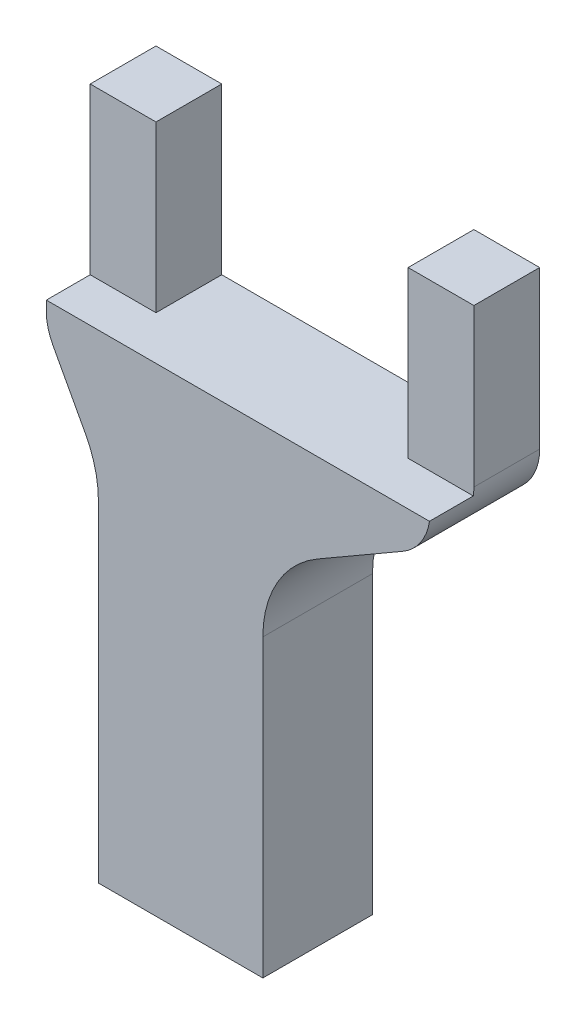
ISO-10303-21;
HEADER;
FILE_DESCRIPTION(('STEP AP214'),'2;1');
FILE_NAME('part.step','',(''),(''),'','','');
FILE_SCHEMA(('AUTOMOTIVE_DESIGN { 1 0 10303 214 1 1 1 1 }'));
ENDSEC;
DATA;
#1=APPLICATION_CONTEXT('core data for automotive mechanical design processes');
#2=APPLICATION_PROTOCOL_DEFINITION('international standard','automotive_design',2000,#1);
#3=PRODUCT_CONTEXT('',#1,'mechanical');
#4=PRODUCT('Part','Part','',(#3));
#5=PRODUCT_RELATED_PRODUCT_CATEGORY('part','',(#4));
#6=PRODUCT_DEFINITION_FORMATION('','',#4);
#7=PRODUCT_DEFINITION_CONTEXT('part definition',#1,'design');
#8=PRODUCT_DEFINITION('design','',#6,#7);
#9=PRODUCT_DEFINITION_SHAPE('','',#8);
#10=(LENGTH_UNIT() NAMED_UNIT(*) SI_UNIT(.MILLI.,.METRE.));
#11=(NAMED_UNIT(*) PLANE_ANGLE_UNIT() SI_UNIT($,.RADIAN.));
#12=(NAMED_UNIT(*) SI_UNIT($,.STERADIAN.) SOLID_ANGLE_UNIT());
#13=UNCERTAINTY_MEASURE_WITH_UNIT(LENGTH_MEASURE(1.E-05),#10,'distance_accuracy_value','');
#14=(GEOMETRIC_REPRESENTATION_CONTEXT(3) GLOBAL_UNCERTAINTY_ASSIGNED_CONTEXT((#13)) GLOBAL_UNIT_ASSIGNED_CONTEXT((#10,
#11,#12)) REPRESENTATION_CONTEXT('',''));
#15=CARTESIAN_POINT('',(0.,0.,0.));
#16=DIRECTION('',(0.,0.,1.));
#17=DIRECTION('',(1.,0.,0.));
#18=AXIS2_PLACEMENT_3D('',#15,#16,#17);
#19=CARTESIAN_POINT('',(-6.24999999999976,526.071170630325,10.));
#20=DIRECTION('',(0.,-1.,0.));
#21=DIRECTION('',(0.,0.,-1.));
#22=AXIS2_PLACEMENT_3D('',#19,#20,#21);
#23=PLANE('',#22);
#24=DIRECTION('',(-1.,0.,0.));
#25=VECTOR('',#24,1.);
#26=CARTESIAN_POINT('',(-12.2499999999998,526.071170630325,6.));
#27=LINE('',#26,#25);
#28=CARTESIAN_POINT('',(-6.24999999999976,526.071170630325,6.));
#29=VERTEX_POINT('',#28);
#30=CARTESIAN_POINT('',(-12.2499999999998,526.071170630325,6.));
#31=VERTEX_POINT('',#30);
#32=EDGE_CURVE('E177',#29,#31,#27,.T.);
#33=ORIENTED_EDGE('',*,*,#32,.F.);
#34=DIRECTION('',(0.,0.,-1.));
#35=VECTOR('',#34,1.);
#36=CARTESIAN_POINT('',(-6.24999999999976,526.071170630325,10.));
#37=LINE('',#36,#35);
#38=CARTESIAN_POINT('',(-6.24999999999976,526.071170630325,0.));
#39=VERTEX_POINT('',#38);
#40=EDGE_CURVE('E209',#29,#39,#37,.T.);
#41=ORIENTED_EDGE('',*,*,#40,.T.);
#42=DIRECTION('',(-1.,0.,0.));
#43=VECTOR('',#42,1.);
#44=CARTESIAN_POINT('',(-6.24999999999976,526.071170630325,0.));
#45=LINE('',#44,#43);
#46=CARTESIAN_POINT('',(-12.2499999999998,526.071170630325,0.));
#47=VERTEX_POINT('',#46);
#48=EDGE_CURVE('E193',#39,#47,#45,.T.);
#49=ORIENTED_EDGE('',*,*,#48,.T.);
#50=DIRECTION('',(0.,0.,-1.));
#51=VECTOR('',#50,1.);
#52=CARTESIAN_POINT('',(-12.2499999999998,526.071170630325,10.));
#53=LINE('',#52,#51);
#54=EDGE_CURVE('E254',#31,#47,#53,.T.);
#55=ORIENTED_EDGE('',*,*,#54,.F.);
#56=EDGE_LOOP('',(#33,#41,#49,#55));
#57=FACE_BOUND('',#56,.T.);
#58=ADVANCED_FACE('F38',(#57),#23,.F.);
#59=CARTESIAN_POINT('',(22.7500000000002,526.071170630325,10.));
#60=DIRECTION('',(-1.,0.,0.));
#61=DIRECTION('',(0.,-1.,0.));
#62=AXIS2_PLACEMENT_3D('',#59,#60,#61);
#63=PLANE('',#62);
#64=DIRECTION('',(0.,1.,0.));
#65=VECTOR('',#64,1.);
#66=CARTESIAN_POINT('',(22.7500000000002,526.071170630325,6.));
#67=LINE('',#66,#65);
#68=CARTESIAN_POINT('',(22.7500000000003,511.729317394923,6.));
#69=VERTEX_POINT('',#68);
#70=CARTESIAN_POINT('',(22.7500000000002,526.071170630325,6.));
#71=VERTEX_POINT('',#70);
#72=EDGE_CURVE('E171',#69,#71,#67,.T.);
#73=ORIENTED_EDGE('',*,*,#72,.F.);
#74=DIRECTION('',(0.,0.,-1.));
#75=VECTOR('',#74,1.);
#76=CARTESIAN_POINT('',(22.7500000000003,511.729317394923,10.));
#77=LINE('',#76,#75);
#78=CARTESIAN_POINT('',(22.7500000000003,511.729317394923,0.));
#79=VERTEX_POINT('',#78);
#80=EDGE_CURVE('E289',#69,#79,#77,.T.);
#81=ORIENTED_EDGE('',*,*,#80,.T.);
#82=DIRECTION('',(0.,1.,0.));
#83=VECTOR('',#82,1.);
#84=CARTESIAN_POINT('',(22.7500000000002,526.071170630325,0.));
#85=LINE('',#84,#83);
#86=CARTESIAN_POINT('',(22.7500000000002,526.071170630325,0.));
#87=VERTEX_POINT('',#86);
#88=EDGE_CURVE('E227',#79,#87,#85,.T.);
#89=ORIENTED_EDGE('',*,*,#88,.T.);
#90=DIRECTION('',(0.,0.,-1.));
#91=VECTOR('',#90,1.);
#92=CARTESIAN_POINT('',(22.7500000000002,526.071170630325,10.));
#93=LINE('',#92,#91);
#94=EDGE_CURVE('E246',#71,#87,#93,.T.);
#95=ORIENTED_EDGE('',*,*,#94,.F.);
#96=EDGE_LOOP('',(#73,#81,#89,#95));
#97=FACE_BOUND('',#96,.T.);
#98=ADVANCED_FACE('F303',(#97),#63,.F.);
#99=CARTESIAN_POINT('',(16.7500000000002,526.071170630325,10.));
#100=DIRECTION('',(0.,-1.,0.));
#101=DIRECTION('',(0.,0.,-1.));
#102=AXIS2_PLACEMENT_3D('',#99,#100,#101);
#103=PLANE('',#102);
#104=CARTESIAN_POINT('',(16.7500000000003,526.071170630325,6.));
#105=VERTEX_POINT('',#104);
#106=EDGE_CURVE('E185',#71,#105,#27,.T.);
#107=ORIENTED_EDGE('',*,*,#106,.F.);
#108=ORIENTED_EDGE('',*,*,#94,.T.);
#109=DIRECTION('',(-1.,0.,0.));
#110=VECTOR('',#109,1.);
#111=CARTESIAN_POINT('',(16.7500000000002,526.071170630325,0.));
#112=LINE('',#111,#110);
#113=CARTESIAN_POINT('',(16.7500000000002,526.071170630325,0.));
#114=VERTEX_POINT('',#113);
#115=EDGE_CURVE('E230',#87,#114,#112,.T.);
#116=ORIENTED_EDGE('',*,*,#115,.T.);
#117=DIRECTION('',(0.,0.,-1.));
#118=VECTOR('',#117,1.);
#119=CARTESIAN_POINT('',(16.7500000000002,526.071170630325,10.));
#120=LINE('',#119,#118);
#121=EDGE_CURVE('E244',#105,#114,#120,.T.);
#122=ORIENTED_EDGE('',*,*,#121,.F.);
#123=EDGE_LOOP('',(#107,#108,#116,#122));
#124=FACE_BOUND('',#123,.T.);
#125=ADVANCED_FACE('F307',(#124),#103,.F.);
#126=CARTESIAN_POINT('',(16.7500000000002,526.071170630325,10.));
#127=DIRECTION('',(1.,0.,0.));
#128=DIRECTION('',(0.,1.,0.));
#129=AXIS2_PLACEMENT_3D('',#126,#127,#128);
#130=PLANE('',#129);
#131=DIRECTION('',(0.,-1.,0.));
#132=VECTOR('',#131,1.);
#133=CARTESIAN_POINT('',(16.7500000000002,526.071170630325,6.));
#134=LINE('',#133,#132);
#135=CARTESIAN_POINT('',(16.7500000000003,511.000207075114,6.));
#136=VERTEX_POINT('',#135);
#137=EDGE_CURVE('E187',#105,#136,#134,.T.);
#138=ORIENTED_EDGE('',*,*,#137,.F.);
#139=ORIENTED_EDGE('',*,*,#121,.T.);
#140=DIRECTION('',(0.,-1.,0.));
#141=VECTOR('',#140,1.);
#142=CARTESIAN_POINT('',(16.7500000000002,526.071170630325,0.));
#143=LINE('',#142,#141);
#144=CARTESIAN_POINT('',(16.7500000000003,511.000207075114,0.));
#145=VERTEX_POINT('',#144);
#146=EDGE_CURVE('E233',#114,#145,#143,.T.);
#147=ORIENTED_EDGE('',*,*,#146,.T.);
#148=DIRECTION('',(0.,0.,-1.));
#149=VECTOR('',#148,1.);
#150=CARTESIAN_POINT('',(16.7500000000003,511.000207075114,10.));
#151=LINE('',#150,#149);
#152=EDGE_CURVE('E242',#136,#145,#151,.T.);
#153=ORIENTED_EDGE('',*,*,#152,.F.);
#154=EDGE_LOOP('',(#138,#139,#147,#153));
#155=FACE_BOUND('',#154,.T.);
#156=ADVANCED_FACE('F313',(#155),#130,.F.);
#157=CARTESIAN_POINT('',(-6.24999999999976,526.071170630325,10.));
#158=DIRECTION('',(-1.,0.,0.));
#159=DIRECTION('',(0.,-1.,0.));
#160=AXIS2_PLACEMENT_3D('',#157,#158,#159);
#161=PLANE('',#160);
#162=DIRECTION('',(0.,1.,0.));
#163=VECTOR('',#162,1.);
#164=CARTESIAN_POINT('',(-6.24999999999976,526.071170630325,6.));
#165=LINE('',#164,#163);
#166=CARTESIAN_POINT('',(-6.24999999999976,511.000207075114,6.));
#167=VERTEX_POINT('',#166);
#168=EDGE_CURVE('E184',#167,#29,#165,.T.);
#169=ORIENTED_EDGE('',*,*,#168,.F.);
#170=DIRECTION('',(0.,0.,-1.));
#171=VECTOR('',#170,1.);
#172=CARTESIAN_POINT('',(-6.24999999999976,511.000207075114,10.));
#173=LINE('',#172,#171);
#174=CARTESIAN_POINT('',(-6.24999999999976,511.000207075114,0.));
#175=VERTEX_POINT('',#174);
#176=EDGE_CURVE('E168',#167,#175,#173,.T.);
#177=ORIENTED_EDGE('',*,*,#176,.T.);
#178=DIRECTION('',(0.,1.,0.));
#179=VECTOR('',#178,1.);
#180=CARTESIAN_POINT('',(-6.24999999999976,526.071170630325,0.));
#181=LINE('',#180,#179);
#182=EDGE_CURVE('E196',#175,#39,#181,.T.);
#183=ORIENTED_EDGE('',*,*,#182,.T.);
#184=ORIENTED_EDGE('',*,*,#40,.F.);
#185=EDGE_LOOP('',(#169,#177,#183,#184));
#186=FACE_BOUND('',#185,.T.);
#187=ADVANCED_FACE('F323',(#186),#161,.F.);
#188=CARTESIAN_POINT('',(-12.2499999999998,526.071170630325,10.));
#189=DIRECTION('',(1.,0.,0.));
#190=DIRECTION('',(0.,1.,0.));
#191=AXIS2_PLACEMENT_3D('',#188,#189,#190);
#192=PLANE('',#191);
#193=DIRECTION('',(0.,-1.,0.));
#194=VECTOR('',#193,1.);
#195=CARTESIAN_POINT('',(-12.2499999999998,526.071170630325,10.));
#196=LINE('',#195,#194);
#197=CARTESIAN_POINT('',(-12.2499999999998,511.000207075114,10.));
#198=VERTEX_POINT('',#197);
#199=CARTESIAN_POINT('',(-12.2499999999998,510.105275726691,10.));
#200=VERTEX_POINT('',#199);
#201=EDGE_CURVE('E183',#198,#200,#196,.T.);
#202=ORIENTED_EDGE('',*,*,#201,.F.);
#203=DIRECTION('',(0.,0.,1.));
#204=VECTOR('',#203,1.);
#205=CARTESIAN_POINT('',(-12.2499999999998,511.000207075114,6.));
#206=LINE('',#205,#204);
#207=CARTESIAN_POINT('',(-12.2499999999998,511.000207075114,6.));
#208=VERTEX_POINT('',#207);
#209=EDGE_CURVE('E165',#208,#198,#206,.T.);
#210=ORIENTED_EDGE('',*,*,#209,.F.);
#211=DIRECTION('',(0.,-1.,0.));
#212=VECTOR('',#211,1.);
#213=CARTESIAN_POINT('',(-12.2499999999998,526.071170630325,6.));
#214=LINE('',#213,#212);
#215=EDGE_CURVE('E174',#31,#208,#214,.T.);
#216=ORIENTED_EDGE('',*,*,#215,.F.);
#217=ORIENTED_EDGE('',*,*,#54,.T.);
#218=DIRECTION('',(0.,-1.,0.));
#219=VECTOR('',#218,1.);
#220=CARTESIAN_POINT('',(-12.2499999999998,526.071170630325,0.));
#221=LINE('',#220,#219);
#222=CARTESIAN_POINT('',(-12.2499999999998,510.105275726691,0.));
#223=VERTEX_POINT('',#222);
#224=EDGE_CURVE('E212',#47,#223,#221,.T.);
#225=ORIENTED_EDGE('',*,*,#224,.T.);
#226=DIRECTION('',(0.,0.,-1.));
#227=VECTOR('',#226,1.);
#228=CARTESIAN_POINT('',(-12.2499999999998,510.105275726691,10.));
#229=LINE('',#228,#227);
#230=EDGE_CURVE('E283',#223,#200,#229,.F.);
#231=ORIENTED_EDGE('',*,*,#230,.T.);
#232=EDGE_LOOP('',(#202,#210,#216,#217,#225,#231));
#233=FACE_BOUND('',#232,.T.);
#234=ADVANCED_FACE('F181',(#233),#192,.F.);
#235=CARTESIAN_POINT('',(-12.2499999999998,508.842566048975,10.));
#236=DIRECTION('',(0.880092531657774,0.474802206945388,0.));
#237=DIRECTION('',(-0.474802206945388,0.880092531657774,0.));
#238=AXIS2_PLACEMENT_3D('',#235,#236,#237);
#239=PLANE('',#238);
#240=DIRECTION('',(0.474802206945388,-0.880092531657774,0.));
#241=VECTOR('',#240,1.);
#242=CARTESIAN_POINT('',(-12.2499999999998,508.842566048975,10.));
#243=LINE('',#242,#241);
#244=CARTESIAN_POINT('',(-11.6504626582886,507.731264691964,10.));
#245=VERTEX_POINT('',#244);
#246=CARTESIAN_POINT('',(-8.69907468342228,502.260577157854,10.));
#247=VERTEX_POINT('',#246);
#248=EDGE_CURVE('E195',#245,#247,#243,.T.);
#249=ORIENTED_EDGE('',*,*,#248,.F.);
#250=DIRECTION('',(0.,0.,-1.));
#251=VECTOR('',#250,1.);
#252=CARTESIAN_POINT('',(-11.6504626582886,507.731264691964,10.));
#253=LINE('',#252,#251);
#254=CARTESIAN_POINT('',(-11.6504626582886,507.731264691964,0.));
#255=VERTEX_POINT('',#254);
#256=EDGE_CURVE('E276',#245,#255,#253,.T.);
#257=ORIENTED_EDGE('',*,*,#256,.T.);
#258=DIRECTION('',(0.474802206945388,-0.880092531657774,0.));
#259=VECTOR('',#258,1.);
#260=CARTESIAN_POINT('',(-12.2499999999998,508.842566048975,0.));
#261=LINE('',#260,#259);
#262=CARTESIAN_POINT('',(-8.69907468342228,502.260577157854,0.));
#263=VERTEX_POINT('',#262);
#264=EDGE_CURVE('E215',#255,#263,#261,.T.);
#265=ORIENTED_EDGE('',*,*,#264,.T.);
#266=DIRECTION('',(0.,0.,-1.));
#267=VECTOR('',#266,1.);
#268=CARTESIAN_POINT('',(-8.69907468342227,502.260577157854,10.));
#269=LINE('',#268,#267);
#270=EDGE_CURVE('E259',#263,#247,#269,.F.);
#271=ORIENTED_EDGE('',*,*,#270,.T.);
#272=EDGE_LOOP('',(#249,#257,#265,#271));
#273=FACE_BOUND('',#272,.T.);
#274=ADVANCED_FACE('F332',(#273),#239,.F.);
#275=CARTESIAN_POINT('',(-7.5,467.320715150803,10.));
#276=DIRECTION('',(1.,0.,0.));
#277=DIRECTION('',(0.,0.,-1.));
#278=AXIS2_PLACEMENT_3D('',#275,#276,#277);
#279=PLANE('',#278);
#280=DIRECTION('',(0.,-1.,0.));
#281=VECTOR('',#280,1.);
#282=CARTESIAN_POINT('',(-7.5,467.320715150803,10.));
#283=LINE('',#282,#281);
#284=CARTESIAN_POINT('',(-7.5,497.5125550884,10.));
#285=VERTEX_POINT('',#284);
#286=CARTESIAN_POINT('',(-7.5,467.320715150803,10.));
#287=VERTEX_POINT('',#286);
#288=EDGE_CURVE('E198',#285,#287,#283,.T.);
#289=ORIENTED_EDGE('',*,*,#288,.F.);
#290=DIRECTION('',(0.,0.,-1.));
#291=VECTOR('',#290,1.);
#292=CARTESIAN_POINT('',(-7.5,497.5125550884,0.));
#293=LINE('',#292,#291);
#294=CARTESIAN_POINT('',(-7.5,497.5125550884,0.));
#295=VERTEX_POINT('',#294);
#296=EDGE_CURVE('E256',#285,#295,#293,.T.);
#297=ORIENTED_EDGE('',*,*,#296,.T.);
#298=DIRECTION('',(0.,-1.,0.));
#299=VECTOR('',#298,1.);
#300=CARTESIAN_POINT('',(-7.5,467.320715150803,0.));
#301=LINE('',#300,#299);
#302=CARTESIAN_POINT('',(-7.5,467.320715150803,0.));
#303=VERTEX_POINT('',#302);
#304=EDGE_CURVE('E217',#295,#303,#301,.T.);
#305=ORIENTED_EDGE('',*,*,#304,.T.);
#306=DIRECTION('',(0.,0.,-1.));
#307=VECTOR('',#306,1.);
#308=CARTESIAN_POINT('',(-7.5,467.320715150803,10.));
#309=LINE('',#308,#307);
#310=EDGE_CURVE('E251',#287,#303,#309,.T.);
#311=ORIENTED_EDGE('',*,*,#310,.F.);
#312=EDGE_LOOP('',(#289,#297,#305,#311));
#313=FACE_BOUND('',#312,.T.);
#314=ADVANCED_FACE('F341',(#313),#279,.F.);
#315=CARTESIAN_POINT('',(7.5,467.320715150803,10.));
#316=DIRECTION('',(0.,1.,0.));
#317=DIRECTION('',(0.,0.,1.));
#318=AXIS2_PLACEMENT_3D('',#315,#316,#317);
#319=PLANE('',#318);
#320=DIRECTION('',(1.,0.,0.));
#321=VECTOR('',#320,1.);
#322=CARTESIAN_POINT('',(7.5,467.320715150803,0.));
#323=LINE('',#322,#321);
#324=CARTESIAN_POINT('',(7.5,467.320715150803,0.));
#325=VERTEX_POINT('',#324);
#326=EDGE_CURVE('E219',#303,#325,#323,.T.);
#327=ORIENTED_EDGE('',*,*,#326,.T.);
#328=DIRECTION('',(0.,0.,-1.));
#329=VECTOR('',#328,1.);
#330=CARTESIAN_POINT('',(7.5,467.320715150803,10.));
#331=LINE('',#330,#329);
#332=CARTESIAN_POINT('',(7.5,467.320715150803,10.));
#333=VERTEX_POINT('',#332);
#334=EDGE_CURVE('E248',#333,#325,#331,.T.);
#335=ORIENTED_EDGE('',*,*,#334,.F.);
#336=DIRECTION('',(1.,0.,0.));
#337=VECTOR('',#336,1.);
#338=CARTESIAN_POINT('',(7.5,467.320715150803,10.));
#339=LINE('',#338,#337);
#340=EDGE_CURVE('E200',#287,#333,#339,.T.);
#341=ORIENTED_EDGE('',*,*,#340,.F.);
#342=ORIENTED_EDGE('',*,*,#310,.T.);
#343=EDGE_LOOP('',(#327,#335,#341,#342));
#344=FACE_BOUND('',#343,.T.);
#345=ADVANCED_FACE('F348',(#344),#319,.F.);
#346=CARTESIAN_POINT('',(7.5,467.320715150803,10.));
#347=DIRECTION('',(-1.,0.,0.));
#348=DIRECTION('',(0.,0.,1.));
#349=AXIS2_PLACEMENT_3D('',#346,#347,#348);
#350=PLANE('',#349);
#351=DIRECTION('',(0.,1.,0.));
#352=VECTOR('',#351,1.);
#353=CARTESIAN_POINT('',(7.5,467.320715150803,0.));
#354=LINE('',#353,#352);
#355=CARTESIAN_POINT('',(7.5,494.264471751936,0.));
#356=VERTEX_POINT('',#355);
#357=EDGE_CURVE('E221',#325,#356,#354,.T.);
#358=ORIENTED_EDGE('',*,*,#357,.T.);
#359=DIRECTION('',(0.,0.,-1.));
#360=VECTOR('',#359,1.);
#361=CARTESIAN_POINT('',(7.5,494.264471751936,10.));
#362=LINE('',#361,#360);
#363=CARTESIAN_POINT('',(7.5,494.264471751936,10.));
#364=VERTEX_POINT('',#363);
#365=EDGE_CURVE('E265',#356,#364,#362,.F.);
#366=ORIENTED_EDGE('',*,*,#365,.T.);
#367=DIRECTION('',(0.,1.,0.));
#368=VECTOR('',#367,1.);
#369=CARTESIAN_POINT('',(7.5,467.320715150803,10.));
#370=LINE('',#369,#368);
#371=EDGE_CURVE('E202',#333,#364,#370,.T.);
#372=ORIENTED_EDGE('',*,*,#371,.F.);
#373=ORIENTED_EDGE('',*,*,#334,.T.);
#374=EDGE_LOOP('',(#358,#366,#372,#373));
#375=FACE_BOUND('',#374,.T.);
#376=ADVANCED_FACE('F362',(#375),#350,.F.);
#377=CARTESIAN_POINT('',(22.7500000000003,508.842566048975,10.));
#378=DIRECTION('',(-0.499999999999999,0.866025403784439,0.));
#379=DIRECTION('',(-0.866025403784439,-0.499999999999999,0.));
#380=AXIS2_PLACEMENT_3D('',#377,#378,#379);
#381=PLANE('',#380);
#382=DIRECTION('',(0.866025403784439,0.499999999999999,0.));
#383=VECTOR('',#382,1.);
#384=CARTESIAN_POINT('',(22.7500000000003,508.842566048975,0.));
#385=LINE('',#384,#383);
#386=CARTESIAN_POINT('',(12.5,502.924725789781,0.));
#387=VERTEX_POINT('',#386);
#388=CARTESIAN_POINT('',(20.2500000000003,507.399190376001,0.));
#389=VERTEX_POINT('',#388);
#390=EDGE_CURVE('E224',#387,#389,#385,.T.);
#391=ORIENTED_EDGE('',*,*,#390,.T.);
#392=DIRECTION('',(0.,0.,-1.));
#393=VECTOR('',#392,1.);
#394=CARTESIAN_POINT('',(20.2500000000003,507.399190376001,10.));
#395=LINE('',#394,#393);
#396=CARTESIAN_POINT('',(20.2500000000003,507.399190376001,10.));
#397=VERTEX_POINT('',#396);
#398=EDGE_CURVE('E291',#389,#397,#395,.F.);
#399=ORIENTED_EDGE('',*,*,#398,.T.);
#400=DIRECTION('',(0.866025403784439,0.499999999999999,0.));
#401=VECTOR('',#400,1.);
#402=CARTESIAN_POINT('',(22.7500000000003,508.842566048975,10.));
#403=LINE('',#402,#401);
#404=CARTESIAN_POINT('',(12.5,502.924725789781,10.));
#405=VERTEX_POINT('',#404);
#406=EDGE_CURVE('E205',#405,#397,#403,.T.);
#407=ORIENTED_EDGE('',*,*,#406,.F.);
#408=DIRECTION('',(0.,0.,-1.));
#409=VECTOR('',#408,1.);
#410=CARTESIAN_POINT('',(12.5,502.924725789781,0.));
#411=LINE('',#410,#409);
#412=EDGE_CURVE('E262',#405,#387,#411,.T.);
#413=ORIENTED_EDGE('',*,*,#412,.T.);
#414=EDGE_LOOP('',(#391,#399,#407,#413));
#415=FACE_BOUND('',#414,.T.);
#416=ADVANCED_FACE('F360',(#415),#381,.F.);
#417=CARTESIAN_POINT('',(-6.24999999999976,511.000207075114,10.));
#418=DIRECTION('',(0.,-1.,0.));
#419=DIRECTION('',(0.,0.,-1.));
#420=AXIS2_PLACEMENT_3D('',#417,#418,#419);
#421=PLANE('',#420);
#422=DIRECTION('',(-1.,0.,0.));
#423=VECTOR('',#422,1.);
#424=CARTESIAN_POINT('',(-6.24999999999976,511.000207075114,10.));
#425=LINE('',#424,#423);
#426=CARTESIAN_POINT('',(22.6965541684642,511.000207075114,10.));
#427=VERTEX_POINT('',#426);
#428=EDGE_CURVE('E53',#427,#198,#425,.T.);
#429=ORIENTED_EDGE('',*,*,#428,.F.);
#430=DIRECTION('',(0.,0.,-1.));
#431=VECTOR('',#430,1.);
#432=CARTESIAN_POINT('',(22.6965541684642,511.000207075114,10.));
#433=LINE('',#432,#431);
#434=CARTESIAN_POINT('',(22.6965541684642,511.000207075114,6.));
#435=VERTEX_POINT('',#434);
#436=EDGE_CURVE('E11',#427,#435,#433,.T.);
#437=ORIENTED_EDGE('',*,*,#436,.T.);
#438=DIRECTION('',(1.,0.,0.));
#439=VECTOR('',#438,1.);
#440=CARTESIAN_POINT('',(-12.2499999999998,511.000207075114,6.));
#441=LINE('',#440,#439);
#442=EDGE_CURVE('E61',#136,#435,#441,.T.);
#443=ORIENTED_EDGE('',*,*,#442,.F.);
#444=ORIENTED_EDGE('',*,*,#152,.T.);
#445=DIRECTION('',(-1.,0.,0.));
#446=VECTOR('',#445,1.);
#447=CARTESIAN_POINT('',(-6.24999999999976,511.000207075114,0.));
#448=LINE('',#447,#446);
#449=EDGE_CURVE('E236',#145,#175,#448,.T.);
#450=ORIENTED_EDGE('',*,*,#449,.T.);
#451=ORIENTED_EDGE('',*,*,#176,.F.);
#452=EDGE_CURVE('E161',#208,#167,#441,.T.);
#453=ORIENTED_EDGE('',*,*,#452,.F.);
#454=ORIENTED_EDGE('',*,*,#209,.T.);
#455=EDGE_LOOP('',(#429,#437,#443,#444,#450,#451,#453,#454));
#456=FACE_BOUND('',#455,.T.);
#457=ADVANCED_FACE('F163',(#456),#421,.F.);
#458=CARTESIAN_POINT('',(0.,0.,10.));
#459=DIRECTION('',(0.,0.,1.));
#460=DIRECTION('',(1.,0.,0.));
#461=AXIS2_PLACEMENT_3D('',#458,#459,#460);
#462=PLANE('',#461);
#463=ORIENTED_EDGE('',*,*,#428,.T.);
#464=ORIENTED_EDGE('',*,*,#201,.T.);
#465=CARTESIAN_POINT('',(-7.24999999999976,510.105275726691,10.));
#466=DIRECTION('',(0.,0.,1.));
#467=DIRECTION('',(1.,0.,0.));
#468=AXIS2_PLACEMENT_3D('',#465,#466,#467);
#469=CIRCLE('',#468,5.);
#470=EDGE_CURVE('E287',#200,#245,#469,.T.);
#471=ORIENTED_EDGE('',*,*,#470,.T.);
#472=ORIENTED_EDGE('',*,*,#248,.T.);
#473=CARTESIAN_POINT('',(-17.5,497.5125550884,10.));
#474=DIRECTION('',(0.,0.,1.));
#475=DIRECTION('',(1.,0.,0.));
#476=AXIS2_PLACEMENT_3D('',#473,#474,#475);
#477=CIRCLE('',#476,10.);
#478=EDGE_CURVE('E270',#247,#285,#477,.F.);
#479=ORIENTED_EDGE('',*,*,#478,.T.);
#480=ORIENTED_EDGE('',*,*,#288,.T.);
#481=ORIENTED_EDGE('',*,*,#340,.T.);
#482=ORIENTED_EDGE('',*,*,#371,.T.);
#483=CARTESIAN_POINT('',(17.5,494.264471751936,10.));
#484=DIRECTION('',(0.,0.,1.));
#485=DIRECTION('',(1.,0.,0.));
#486=AXIS2_PLACEMENT_3D('',#483,#484,#485);
#487=CIRCLE('',#486,10.);
#488=EDGE_CURVE('E274',#364,#405,#487,.F.);
#489=ORIENTED_EDGE('',*,*,#488,.T.);
#490=ORIENTED_EDGE('',*,*,#406,.T.);
#491=CARTESIAN_POINT('',(17.7500000000003,511.729317394923,10.));
#492=DIRECTION('',(0.,0.,1.));
#493=DIRECTION('',(1.,0.,0.));
#494=AXIS2_PLACEMENT_3D('',#491,#492,#493);
#495=CIRCLE('',#494,5.);
#496=EDGE_CURVE('E285',#397,#427,#495,.T.);
#497=ORIENTED_EDGE('',*,*,#496,.T.);
#498=EDGE_LOOP('',(#463,#464,#471,#472,#479,#480,#481,#482,#489,#490,#497));
#499=FACE_BOUND('',#498,.T.);
#500=ADVANCED_FACE('F335',(#499),#462,.T.);
#501=CARTESIAN_POINT('',(0.,0.,0.));
#502=DIRECTION('',(0.,0.,1.));
#503=DIRECTION('',(1.,0.,0.));
#504=AXIS2_PLACEMENT_3D('',#501,#502,#503);
#505=PLANE('',#504);
#506=ORIENTED_EDGE('',*,*,#264,.F.);
#507=CARTESIAN_POINT('',(-7.24999999999976,510.105275726691,0.));
#508=DIRECTION('',(0.,0.,1.));
#509=DIRECTION('',(1.,0.,0.));
#510=AXIS2_PLACEMENT_3D('',#507,#508,#509);
#511=CIRCLE('',#510,5.);
#512=EDGE_CURVE('E281',#255,#223,#511,.F.);
#513=ORIENTED_EDGE('',*,*,#512,.T.);
#514=ORIENTED_EDGE('',*,*,#224,.F.);
#515=ORIENTED_EDGE('',*,*,#48,.F.);
#516=ORIENTED_EDGE('',*,*,#182,.F.);
#517=ORIENTED_EDGE('',*,*,#449,.F.);
#518=ORIENTED_EDGE('',*,*,#146,.F.);
#519=ORIENTED_EDGE('',*,*,#115,.F.);
#520=ORIENTED_EDGE('',*,*,#88,.F.);
#521=CARTESIAN_POINT('',(17.7500000000003,511.729317394923,0.));
#522=DIRECTION('',(0.,0.,1.));
#523=DIRECTION('',(1.,0.,0.));
#524=AXIS2_PLACEMENT_3D('',#521,#522,#523);
#525=CIRCLE('',#524,5.);
#526=EDGE_CURVE('E279',#79,#389,#525,.F.);
#527=ORIENTED_EDGE('',*,*,#526,.T.);
#528=ORIENTED_EDGE('',*,*,#390,.F.);
#529=CARTESIAN_POINT('',(17.5,494.264471751936,0.));
#530=DIRECTION('',(0.,0.,1.));
#531=DIRECTION('',(1.,0.,0.));
#532=AXIS2_PLACEMENT_3D('',#529,#530,#531);
#533=CIRCLE('',#532,10.);
#534=EDGE_CURVE('E272',#387,#356,#533,.T.);
#535=ORIENTED_EDGE('',*,*,#534,.T.);
#536=ORIENTED_EDGE('',*,*,#357,.F.);
#537=ORIENTED_EDGE('',*,*,#326,.F.);
#538=ORIENTED_EDGE('',*,*,#304,.F.);
#539=CARTESIAN_POINT('',(-17.5,497.5125550884,0.));
#540=DIRECTION('',(0.,0.,1.));
#541=DIRECTION('',(1.,0.,0.));
#542=AXIS2_PLACEMENT_3D('',#539,#540,#541);
#543=CIRCLE('',#542,10.);
#544=EDGE_CURVE('E267',#295,#263,#543,.T.);
#545=ORIENTED_EDGE('',*,*,#544,.T.);
#546=EDGE_LOOP('',(#506,#513,#514,#515,#516,#517,#518,#519,#520,#527,#528,#535,#536,#537,#538,#545));
#547=FACE_BOUND('',#546,.T.);
#548=ADVANCED_FACE('F319',(#547),#505,.F.);
#549=CARTESIAN_POINT('',(-17.5,497.5125550884,10.));
#550=DIRECTION('',(0.,0.,1.));
#551=DIRECTION('',(1.,0.,0.));
#552=AXIS2_PLACEMENT_3D('',#549,#550,#551);
#553=CYLINDRICAL_SURFACE('',#552,10.);
#554=ORIENTED_EDGE('',*,*,#478,.F.);
#555=ORIENTED_EDGE('',*,*,#270,.F.);
#556=ORIENTED_EDGE('',*,*,#544,.F.);
#557=ORIENTED_EDGE('',*,*,#296,.F.);
#558=EDGE_LOOP('',(#554,#555,#556,#557));
#559=FACE_BOUND('',#558,.T.);
#560=ADVANCED_FACE('F344',(#559),#553,.F.);
#561=CARTESIAN_POINT('',(17.5,494.264471751936,10.));
#562=DIRECTION('',(0.,0.,1.));
#563=DIRECTION('',(1.,0.,0.));
#564=AXIS2_PLACEMENT_3D('',#561,#562,#563);
#565=CYLINDRICAL_SURFACE('',#564,10.);
#566=ORIENTED_EDGE('',*,*,#488,.F.);
#567=ORIENTED_EDGE('',*,*,#365,.F.);
#568=ORIENTED_EDGE('',*,*,#534,.F.);
#569=ORIENTED_EDGE('',*,*,#412,.F.);
#570=EDGE_LOOP('',(#566,#567,#568,#569));
#571=FACE_BOUND('',#570,.T.);
#572=ADVANCED_FACE('F357',(#571),#565,.F.);
#573=CARTESIAN_POINT('',(-7.24999999999976,510.105275726691,10.));
#574=DIRECTION('',(0.,0.,-1.));
#575=DIRECTION('',(-1.,0.,0.));
#576=AXIS2_PLACEMENT_3D('',#573,#574,#575);
#577=CYLINDRICAL_SURFACE('',#576,5.);
#578=ORIENTED_EDGE('',*,*,#470,.F.);
#579=ORIENTED_EDGE('',*,*,#230,.F.);
#580=ORIENTED_EDGE('',*,*,#512,.F.);
#581=ORIENTED_EDGE('',*,*,#256,.F.);
#582=EDGE_LOOP('',(#578,#579,#580,#581));
#583=FACE_BOUND('',#582,.T.);
#584=ADVANCED_FACE('F329',(#583),#577,.T.);
#585=CARTESIAN_POINT('',(17.7500000000003,511.729317394923,10.));
#586=DIRECTION('',(0.,0.,-1.));
#587=DIRECTION('',(-1.,0.,0.));
#588=AXIS2_PLACEMENT_3D('',#585,#586,#587);
#589=CYLINDRICAL_SURFACE('',#588,5.);
#590=ORIENTED_EDGE('',*,*,#436,.F.);
#591=ORIENTED_EDGE('',*,*,#496,.F.);
#592=ORIENTED_EDGE('',*,*,#398,.F.);
#593=ORIENTED_EDGE('',*,*,#526,.F.);
#594=ORIENTED_EDGE('',*,*,#80,.F.);
#595=CARTESIAN_POINT('',(17.7500000000003,511.729317394923,6.));
#596=DIRECTION('',(0.,0.,1.));
#597=DIRECTION('',(1.,0.,0.));
#598=AXIS2_PLACEMENT_3D('',#595,#596,#597);
#599=CIRCLE('',#598,5.);
#600=EDGE_CURVE('E46',#69,#435,#599,.F.);
#601=ORIENTED_EDGE('',*,*,#600,.T.);
#602=EDGE_LOOP('',(#590,#591,#592,#593,#594,#601));
#603=FACE_BOUND('',#602,.T.);
#604=ADVANCED_FACE('F40',(#603),#589,.T.);
#605=CARTESIAN_POINT('',(0.,0.,6.));
#606=DIRECTION('',(0.,0.,1.));
#607=DIRECTION('',(1.,0.,0.));
#608=AXIS2_PLACEMENT_3D('',#605,#606,#607);
#609=PLANE('',#608);
#610=ORIENTED_EDGE('',*,*,#137,.T.);
#611=ORIENTED_EDGE('',*,*,#442,.T.);
#612=ORIENTED_EDGE('',*,*,#600,.F.);
#613=ORIENTED_EDGE('',*,*,#72,.T.);
#614=ORIENTED_EDGE('',*,*,#106,.T.);
#615=EDGE_LOOP('',(#610,#611,#612,#613,#614));
#616=FACE_BOUND('',#615,.T.);
#617=ADVANCED_FACE('F299',(#616),#609,.T.);
#618=ORIENTED_EDGE('',*,*,#168,.T.);
#619=ORIENTED_EDGE('',*,*,#32,.T.);
#620=ORIENTED_EDGE('',*,*,#215,.T.);
#621=ORIENTED_EDGE('',*,*,#452,.T.);
#622=EDGE_LOOP('',(#618,#619,#620,#621));
#623=FACE_BOUND('',#622,.T.);
#624=ADVANCED_FACE('F175',(#623),#609,.T.);
#625=CLOSED_SHELL('',(#58,#98,#125,#156,#187,#234,#274,#314,#345,#376,#416,#457,#500,#548,#560,
#572,#584,#604,#617,#624));
#626=MANIFOLD_SOLID_BREP('B2',#625);
#627=ADVANCED_BREP_SHAPE_REPRESENTATION('',(#18,#626),#14);
#628=SHAPE_DEFINITION_REPRESENTATION(#9,#627);
ENDSEC;
END-ISO-10303-21;
